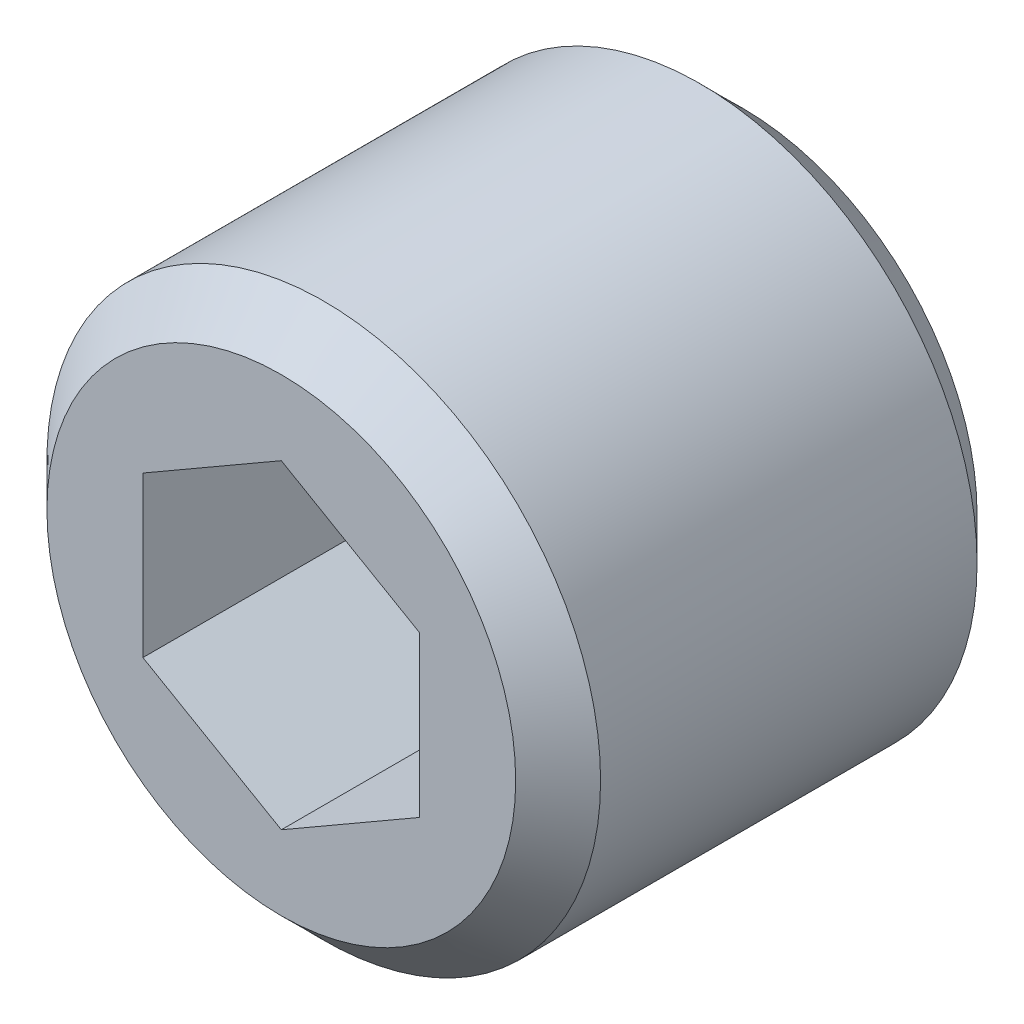
ISO-10303-21;
HEADER;
FILE_DESCRIPTION(('STEP AP214'),'2;1');
FILE_NAME('part.step','',(''),(''),'','','');
FILE_SCHEMA(('AUTOMOTIVE_DESIGN { 1 0 10303 214 1 1 1 1 }'));
ENDSEC;
DATA;
#1=APPLICATION_CONTEXT('core data for automotive mechanical design processes');
#2=APPLICATION_PROTOCOL_DEFINITION('international standard','automotive_design',2000,#1);
#3=PRODUCT_CONTEXT('',#1,'mechanical');
#4=PRODUCT('Part','Part','',(#3));
#5=PRODUCT_RELATED_PRODUCT_CATEGORY('part','',(#4));
#6=PRODUCT_DEFINITION_FORMATION('','',#4);
#7=PRODUCT_DEFINITION_CONTEXT('part definition',#1,'design');
#8=PRODUCT_DEFINITION('design','',#6,#7);
#9=PRODUCT_DEFINITION_SHAPE('','',#8);
#10=(LENGTH_UNIT() NAMED_UNIT(*) SI_UNIT(.MILLI.,.METRE.));
#11=(NAMED_UNIT(*) PLANE_ANGLE_UNIT() SI_UNIT($,.RADIAN.));
#12=(NAMED_UNIT(*) SI_UNIT($,.STERADIAN.) SOLID_ANGLE_UNIT());
#13=UNCERTAINTY_MEASURE_WITH_UNIT(LENGTH_MEASURE(1.E-05),#10,'distance_accuracy_value','');
#14=(GEOMETRIC_REPRESENTATION_CONTEXT(3) GLOBAL_UNCERTAINTY_ASSIGNED_CONTEXT((#13)) GLOBAL_UNIT_ASSIGNED_CONTEXT((#10,
#11,#12)) REPRESENTATION_CONTEXT('',''));
#15=CARTESIAN_POINT('',(0.,0.,0.));
#16=DIRECTION('',(0.,0.,1.));
#17=DIRECTION('',(1.,0.,0.));
#18=AXIS2_PLACEMENT_3D('',#15,#16,#17);
#19=CARTESIAN_POINT('',(0.,0.,10.));
#20=DIRECTION('',(0.,0.,-1.));
#21=DIRECTION('',(-1.,0.,0.));
#22=AXIS2_PLACEMENT_3D('',#19,#20,#21);
#23=PLANE('',#22);
#24=CARTESIAN_POINT('',(0.,0.,10.));
#25=DIRECTION('',(0.,0.,1.));
#26=DIRECTION('',(1.,0.,0.));
#27=AXIS2_PLACEMENT_3D('',#24,#25,#26);
#28=CIRCLE('',#27,5.08);
#29=CARTESIAN_POINT('',(5.08,0.,10.));
#30=VERTEX_POINT('',#29);
#31=EDGE_CURVE('E143',#30,#30,#28,.T.);
#32=ORIENTED_EDGE('',*,*,#31,.T.);
#33=EDGE_LOOP('',(#32));
#34=FACE_BOUND('',#33,.T.);
#35=DIRECTION('',(-0.866025403784439,-0.5,0.));
#36=VECTOR('',#35,1.);
#37=CARTESIAN_POINT('',(0.,3.46410161513775,10.));
#38=LINE('',#37,#36);
#39=CARTESIAN_POINT('',(0.,3.46410161513775,10.));
#40=VERTEX_POINT('',#39);
#41=CARTESIAN_POINT('',(-3.,1.73205080756888,10.));
#42=VERTEX_POINT('',#41);
#43=EDGE_CURVE('E111',#40,#42,#38,.T.);
#44=ORIENTED_EDGE('',*,*,#43,.F.);
#45=DIRECTION('',(-0.866025403784439,0.5,0.));
#46=VECTOR('',#45,1.);
#47=CARTESIAN_POINT('',(3.,1.73205080756888,10.));
#48=LINE('',#47,#46);
#49=CARTESIAN_POINT('',(3.,1.73205080756888,10.));
#50=VERTEX_POINT('',#49);
#51=EDGE_CURVE('E123',#50,#40,#48,.T.);
#52=ORIENTED_EDGE('',*,*,#51,.F.);
#53=DIRECTION('',(0.,1.,0.));
#54=VECTOR('',#53,1.);
#55=CARTESIAN_POINT('',(3.,-1.73205080756888,10.));
#56=LINE('',#55,#54);
#57=CARTESIAN_POINT('',(3.,-1.73205080756888,10.));
#58=VERTEX_POINT('',#57);
#59=EDGE_CURVE('E117',#58,#50,#56,.T.);
#60=ORIENTED_EDGE('',*,*,#59,.F.);
#61=DIRECTION('',(0.866025403784439,0.5,0.));
#62=VECTOR('',#61,1.);
#63=CARTESIAN_POINT('',(0.,-3.46410161513775,10.));
#64=LINE('',#63,#62);
#65=CARTESIAN_POINT('',(0.,-3.46410161513775,10.));
#66=VERTEX_POINT('',#65);
#67=EDGE_CURVE('E115',#66,#58,#64,.T.);
#68=ORIENTED_EDGE('',*,*,#67,.F.);
#69=DIRECTION('',(0.866025403784439,-0.5,0.));
#70=VECTOR('',#69,1.);
#71=CARTESIAN_POINT('',(-3.,-1.73205080756888,10.));
#72=LINE('',#71,#70);
#73=CARTESIAN_POINT('',(-3.,-1.73205080756888,10.));
#74=VERTEX_POINT('',#73);
#75=EDGE_CURVE('E96',#74,#66,#72,.T.);
#76=ORIENTED_EDGE('',*,*,#75,.F.);
#77=DIRECTION('',(0.,-1.,0.));
#78=VECTOR('',#77,1.);
#79=CARTESIAN_POINT('',(-3.,1.73205080756888,10.));
#80=LINE('',#79,#78);
#81=EDGE_CURVE('E105',#42,#74,#80,.T.);
#82=ORIENTED_EDGE('',*,*,#81,.F.);
#83=EDGE_LOOP('',(#44,#52,#60,#68,#76,#82));
#84=FACE_BOUND('',#83,.T.);
#85=ADVANCED_FACE('F37',(#34,#84),#23,.F.);
#86=CARTESIAN_POINT('',(0.,0.,9.08));
#87=DIRECTION('',(0.,0.,-1.));
#88=DIRECTION('',(-1.,0.,0.));
#89=AXIS2_PLACEMENT_3D('',#86,#87,#88);
#90=CONICAL_SURFACE('',#89,6.,0.785398163397448);
#91=ORIENTED_EDGE('',*,*,#31,.F.);
#92=EDGE_LOOP('',(#91));
#93=FACE_BOUND('',#92,.T.);
#94=CARTESIAN_POINT('',(0.,0.,9.08));
#95=DIRECTION('',(0.,0.,1.));
#96=DIRECTION('',(1.,0.,0.));
#97=AXIS2_PLACEMENT_3D('',#94,#95,#96);
#98=CIRCLE('',#97,6.);
#99=CARTESIAN_POINT('',(6.,0.,9.08));
#100=VERTEX_POINT('',#99);
#101=EDGE_CURVE('E140',#100,#100,#98,.T.);
#102=ORIENTED_EDGE('',*,*,#101,.T.);
#103=EDGE_LOOP('',(#102));
#104=FACE_BOUND('',#103,.T.);
#105=ADVANCED_FACE('F205',(#93,#104),#90,.T.);
#106=CARTESIAN_POINT('',(0.,0.,0.));
#107=DIRECTION('',(0.,0.,1.));
#108=DIRECTION('',(1.,0.,0.));
#109=AXIS2_PLACEMENT_3D('',#106,#107,#108);
#110=CYLINDRICAL_SURFACE('',#109,6.);
#111=ORIENTED_EDGE('',*,*,#101,.F.);
#112=EDGE_LOOP('',(#111));
#113=FACE_BOUND('',#112,.T.);
#114=CARTESIAN_POINT('',(0.,0.,0.92));
#115=DIRECTION('',(0.,0.,1.));
#116=DIRECTION('',(1.,0.,0.));
#117=AXIS2_PLACEMENT_3D('',#114,#115,#116);
#118=CIRCLE('',#117,6.);
#119=CARTESIAN_POINT('',(6.,0.,0.92));
#120=VERTEX_POINT('',#119);
#121=EDGE_CURVE('E137',#120,#120,#118,.T.);
#122=ORIENTED_EDGE('',*,*,#121,.T.);
#123=EDGE_LOOP('',(#122));
#124=FACE_BOUND('',#123,.T.);
#125=ADVANCED_FACE('F210',(#113,#124),#110,.T.);
#126=CARTESIAN_POINT('',(0.,0.,0.));
#127=DIRECTION('',(0.,0.,1.));
#128=DIRECTION('',(1.,0.,0.));
#129=AXIS2_PLACEMENT_3D('',#126,#127,#128);
#130=CONICAL_SURFACE('',#129,5.08,0.785398163397448);
#131=ORIENTED_EDGE('',*,*,#121,.F.);
#132=EDGE_LOOP('',(#131));
#133=FACE_BOUND('',#132,.T.);
#134=CARTESIAN_POINT('',(0.,0.,0.));
#135=DIRECTION('',(0.,0.,1.));
#136=DIRECTION('',(1.,0.,0.));
#137=AXIS2_PLACEMENT_3D('',#134,#135,#136);
#138=CIRCLE('',#137,5.08);
#139=CARTESIAN_POINT('',(5.08,0.,0.));
#140=VERTEX_POINT('',#139);
#141=EDGE_CURVE('E128',#140,#140,#138,.T.);
#142=ORIENTED_EDGE('',*,*,#141,.T.);
#143=EDGE_LOOP('',(#142));
#144=FACE_BOUND('',#143,.T.);
#145=ADVANCED_FACE('F218',(#133,#144),#130,.T.);
#146=CARTESIAN_POINT('',(0.,5.08,0.));
#147=DIRECTION('',(0.,0.,1.));
#148=DIRECTION('',(1.,0.,0.));
#149=AXIS2_PLACEMENT_3D('',#146,#147,#148);
#150=PLANE('',#149);
#151=ORIENTED_EDGE('',*,*,#141,.F.);
#152=EDGE_LOOP('',(#151));
#153=FACE_BOUND('',#152,.T.);
#154=ADVANCED_FACE('F164',(#153),#150,.F.);
#155=CARTESIAN_POINT('',(0.,3.46410161513775,2.5));
#156=DIRECTION('',(-0.5,0.866025403784439,0.));
#157=DIRECTION('',(-0.866025403784439,-0.5,0.));
#158=AXIS2_PLACEMENT_3D('',#155,#156,#157);
#159=PLANE('',#158);
#160=CARTESIAN_POINT('',(0.0002,3.46421708519159,4.71139153540508));
#161=CARTESIAN_POINT('',(-0.131635206588332,3.38810199317915,4.66742937742637));
#162=CARTESIAN_POINT('',(-0.264608405355249,3.31132988107606,4.62744725926669));
#163=CARTESIAN_POINT('',(-0.532857420002056,3.15645624025988,4.55765775341953));
#164=CARTESIAN_POINT('',(-0.668138002634342,3.078351959461,4.52787505523945));
#165=CARTESIAN_POINT('',(-0.937022602096483,2.92311136358059,4.48151351218532));
#166=CARTESIAN_POINT('',(-1.07058524542946,2.84599893549861,4.46462611409702));
#167=CARTESIAN_POINT('',(-1.33833905729569,2.6914112001411,4.44446531542259));
#168=CARTESIAN_POINT('',(-1.47252925247984,2.61393645482892,4.44117522075515));
#169=CARTESIAN_POINT('',(-1.72327559769581,2.46916798492017,4.44801620385946));
#170=CARTESIAN_POINT('',(-1.83986926497268,2.40185259973206,4.45646758716668));
#171=CARTESIAN_POINT('',(-2.07229698497464,2.2676603930218,4.4832546159811));
#172=CARTESIAN_POINT('',(-2.18813023365133,2.2007840357172,4.50159941383578));
#173=CARTESIAN_POINT('',(-2.42103725705637,2.06631510305815,4.54746042382739));
#174=CARTESIAN_POINT('',(-2.53808155051394,1.99873954872331,4.57517105823715));
#175=CARTESIAN_POINT('',(-2.77042435049913,1.86459637060759,4.63806346811147));
#176=CARTESIAN_POINT('',(-2.88572583417111,1.79802702797161,4.67323046399562));
#177=CARTESIAN_POINT('',(-3.0002,1.73193533751504,4.71139153540508));
#178=B_SPLINE_CURVE_WITH_KNOTS('',3,(#160,#161,#162,#163,#164,#165,#166,#167,#168,#169,#170,
#171,#172,#173,#174,#175,#176,#177),.UNSPECIFIED.,.F.,.F.,(4,2,2,2,2,2,2,2,4),(0.,
0.475539830103041,0.952222784107964,1.41710776961288,1.88142182298026,2.28572436316091,
2.69040156475039,3.10405572063576,3.5168974940707),.UNSPECIFIED.);
#179=CARTESIAN_POINT('',(0.,3.46410161513775,4.71132486540519));
#180=VERTEX_POINT('',#179);
#181=CARTESIAN_POINT('',(-3.,1.73205080756888,4.71132486540519));
#182=VERTEX_POINT('',#181);
#183=EDGE_CURVE('E11',#180,#182,#178,.T.);
#184=ORIENTED_EDGE('',*,*,#183,.F.);
#185=DIRECTION('',(0.,0.,1.));
#186=VECTOR('',#185,1.);
#187=CARTESIAN_POINT('',(0.,3.46410161513775,2.5));
#188=LINE('',#187,#186);
#189=EDGE_CURVE('E126',#180,#40,#188,.T.);
#190=ORIENTED_EDGE('',*,*,#189,.T.);
#191=ORIENTED_EDGE('',*,*,#43,.T.);
#192=DIRECTION('',(0.,0.,1.));
#193=VECTOR('',#192,1.);
#194=CARTESIAN_POINT('',(-3.,1.73205080756888,2.5));
#195=LINE('',#194,#193);
#196=EDGE_CURVE('E102',#182,#42,#195,.T.);
#197=ORIENTED_EDGE('',*,*,#196,.F.);
#198=EDGE_LOOP('',(#184,#190,#191,#197));
#199=FACE_BOUND('',#198,.T.);
#200=ADVANCED_FACE('F162',(#199),#159,.F.);
#201=CARTESIAN_POINT('',(3.,1.73205080756888,2.5));
#202=DIRECTION('',(0.5,0.866025403784439,0.));
#203=DIRECTION('',(-0.866025403784439,0.5,0.));
#204=AXIS2_PLACEMENT_3D('',#201,#202,#203);
#205=PLANE('',#204);
#206=CARTESIAN_POINT('',(3.0002,1.73193533751504,4.71139153540508));
#207=CARTESIAN_POINT('',(2.86836479341167,1.80805042952748,4.66742937742637));
#208=CARTESIAN_POINT('',(2.73539159464475,1.88482254163057,4.62744725926669));
#209=CARTESIAN_POINT('',(2.46714257999794,2.03969618244675,4.55765775341953));
#210=CARTESIAN_POINT('',(2.33186199736566,2.11780046324563,4.52787505523945));
#211=CARTESIAN_POINT('',(2.06297739790352,2.27304105912605,4.48151351218532));
#212=CARTESIAN_POINT('',(1.92941475457054,2.35015348720802,4.46462611409702));
#213=CARTESIAN_POINT('',(1.66166094270431,2.50474122256553,4.44446531542259));
#214=CARTESIAN_POINT('',(1.52747074752016,2.58221596787771,4.44117522075515));
#215=CARTESIAN_POINT('',(1.27672440230419,2.72698443778646,4.44801620385946));
#216=CARTESIAN_POINT('',(1.16013073502732,2.79429982297457,4.45646758716668));
#217=CARTESIAN_POINT('',(0.927703015025363,2.92849202968483,4.4832546159811));
#218=CARTESIAN_POINT('',(0.811869766348669,2.99536838698943,4.50159941383578));
#219=CARTESIAN_POINT('',(0.578962742943632,3.12983731964848,4.54746042382739));
#220=CARTESIAN_POINT('',(0.461918449486059,3.19741287398332,4.57517105823715));
#221=CARTESIAN_POINT('',(0.229575649500875,3.33155605209904,4.63806346811147));
#222=CARTESIAN_POINT('',(0.114274165828893,3.39812539473502,4.67323046399562));
#223=CARTESIAN_POINT('',(-0.000199999999999983,3.46421708519159,4.71139153540508));
#224=B_SPLINE_CURVE_WITH_KNOTS('',3,(#206,#207,#208,#209,#210,#211,#212,#213,#214,#215,#216,
#217,#218,#219,#220,#221,#222,#223),.UNSPECIFIED.,.F.,.F.,(4,2,2,2,2,2,2,2,4),(0.,
0.475539830103041,0.952222784107965,1.41710776961288,1.88142182298026,2.28572436316091,
2.69040156475039,3.10405572063576,3.5168974940707),.UNSPECIFIED.);
#225=CARTESIAN_POINT('',(3.,1.73205080756888,4.71132486540519));
#226=VERTEX_POINT('',#225);
#227=EDGE_CURVE('E49',#226,#180,#224,.T.);
#228=ORIENTED_EDGE('',*,*,#227,.F.);
#229=DIRECTION('',(0.,0.,1.));
#230=VECTOR('',#229,1.);
#231=CARTESIAN_POINT('',(3.,1.73205080756888,2.5));
#232=LINE('',#231,#230);
#233=EDGE_CURVE('E129',#226,#50,#232,.T.);
#234=ORIENTED_EDGE('',*,*,#233,.T.);
#235=ORIENTED_EDGE('',*,*,#51,.T.);
#236=ORIENTED_EDGE('',*,*,#189,.F.);
#237=EDGE_LOOP('',(#228,#234,#235,#236));
#238=FACE_BOUND('',#237,.T.);
#239=ADVANCED_FACE('F187',(#238),#205,.F.);
#240=CARTESIAN_POINT('',(3.,-1.73205080756888,2.5));
#241=DIRECTION('',(1.,0.,0.));
#242=DIRECTION('',(0.,0.,-1.));
#243=AXIS2_PLACEMENT_3D('',#240,#241,#242);
#244=PLANE('',#243);
#245=CARTESIAN_POINT('',(3.,-4.55230689403347,5.85899585930235));
#246=CARTESIAN_POINT('',(3.,-4.42203285683307,5.7962111628357));
#247=CARTESIAN_POINT('',(3.,-4.29144864140818,5.73405844321591));
#248=CARTESIAN_POINT('',(3.,-4.02949438213665,5.61137477637716));
#249=CARTESIAN_POINT('',(3.,-3.89812420827163,5.55084410710208));
#250=CARTESIAN_POINT('',(3.,-3.6337067113352,5.43143621632039));
#251=CARTESIAN_POINT('',(3.,-3.50065407388474,5.37257072012657));
#252=CARTESIAN_POINT('',(3.,-3.23345415290409,5.25738841221934));
#253=CARTESIAN_POINT('',(3.,-3.09930692480774,5.20107147237228));
#254=CARTESIAN_POINT('',(3.,-2.82588517797245,5.09011307579175));
#255=CARTESIAN_POINT('',(3.,-2.68657294057704,5.03556403326917));
#256=CARTESIAN_POINT('',(3.,-2.40628236551813,4.93084240932163));
#257=CARTESIAN_POINT('',(3.,-2.26530383804691,4.88067033204167));
#258=CARTESIAN_POINT('',(3.,-1.98175401159729,4.78609298143692));
#259=CARTESIAN_POINT('',(3.,-1.83918695231228,4.74167513073786));
#260=CARTESIAN_POINT('',(3.,-1.55201210630947,4.66009640628812));
#261=CARTESIAN_POINT('',(3.,-1.40740500925706,4.62293314020297));
#262=CARTESIAN_POINT('',(3.,-1.1167965938135,4.55788959953983));
#263=CARTESIAN_POINT('',(3.,-0.970805099385889,4.52996626721176));
#264=CARTESIAN_POINT('',(3.,-0.677117813764697,4.485066605421));
#265=CARTESIAN_POINT('',(3.,-0.529422162917341,4.46808938094696));
#266=CARTESIAN_POINT('',(3.,-0.234947872719646,4.44665893994668));
#267=CARTESIAN_POINT('',(3.,-0.0881806476191099,4.44205270381854));
#268=CARTESIAN_POINT('',(3.,0.205223700430044,4.44535767658371));
#269=CARTESIAN_POINT('',(3.,0.351860816135455,4.45326954337094));
#270=CARTESIAN_POINT('',(3.,0.6038143144584,4.47707569150937));
#271=CARTESIAN_POINT('',(3.,0.709408361992604,4.49017769585107));
#272=CARTESIAN_POINT('',(3.,0.919752203146273,4.52200144465044));
#273=CARTESIAN_POINT('',(3.,1.0245018670034,4.54072403657188));
#274=CARTESIAN_POINT('',(3.,1.33737934263405,4.60433074195981));
#275=CARTESIAN_POINT('',(3.,1.5440105429606,4.65664047336866));
#276=CARTESIAN_POINT('',(3.,1.85301747518895,4.74647581628311));
#277=CARTESIAN_POINT('',(3.,1.95701259047927,4.77874047880009));
#278=CARTESIAN_POINT('',(3.,2.16399092996711,4.84639542154271));
#279=CARTESIAN_POINT('',(3.,2.26697414681474,4.88178572445271));
#280=CARTESIAN_POINT('',(3.,2.47196758644286,4.9551426835252));
#281=CARTESIAN_POINT('',(3.,2.57397815476855,4.99310838264893));
#282=CARTESIAN_POINT('',(3.,2.77716764226868,5.07119196477891));
#283=CARTESIAN_POINT('',(3.,2.87834657691569,5.11130980763946));
#284=CARTESIAN_POINT('',(3.,3.1427988397967,5.21889117201627));
#285=CARTESIAN_POINT('',(3.,3.30547673060152,5.28781669676308));
#286=CARTESIAN_POINT('',(3.,3.62929414058288,5.4292025916987));
#287=CARTESIAN_POINT('',(3.,3.79043352555562,5.50166326695025));
#288=CARTESIAN_POINT('',(3.,4.11151294519169,5.64930087634801));
#289=CARTESIAN_POINT('',(3.,4.27145263944,5.72447854867576));
#290=CARTESIAN_POINT('',(3.,4.59033118664394,5.87693083602436));
#291=CARTESIAN_POINT('',(3.,4.74927001468937,5.9542055029844));
#292=CARTESIAN_POINT('',(3.,5.22528915394053,6.18868132540013));
#293=CARTESIAN_POINT('',(3.,5.54115737515172,6.3483405284975));
#294=CARTESIAN_POINT('',(3.,6.17067040855709,6.67182875308413));
#295=CARTESIAN_POINT('',(3.,6.48431557808157,6.83565708406486));
#296=CARTESIAN_POINT('',(3.,7.07911538948717,7.14982892231997));
#297=CARTESIAN_POINT('',(3.,7.36041306603152,7.29990207130388));
#298=CARTESIAN_POINT('',(3.,7.92210237114853,7.60176445255836));
#299=CARTESIAN_POINT('',(3.,8.20249395488181,7.7535537681332));
#300=CARTESIAN_POINT('',(3.,8.7617995572567,8.05798833967632));
#301=CARTESIAN_POINT('',(3.,9.0407155161595,8.21063003499564));
#302=CARTESIAN_POINT('',(3.,9.59798153995336,8.51690105922796));
#303=CARTESIAN_POINT('',(3.,9.87633164004697,8.67053032406442));
#304=CARTESIAN_POINT('',(3.,10.1544806879411,8.82452037571372));
#305=B_SPLINE_CURVE_WITH_KNOTS('',3,(#245,#246,#247,#248,#249,#250,#251,#252,#253,#254,#255,
#256,#257,#258,#259,#260,#261,#262,#263,#264,#265,#266,#267,#268,#269,#270,#271,#272,#273,#274,
#275,#276,#277,#278,#279,#280,#281,#282,#283,#284,#285,#286,#287,#288,#289,#290,#291,#292,#293,
#294,#295,#296,#297,#298,#299,#300,#301,#302,#303,#304),.UNSPECIFIED.,.F.,.F.,(4,2,2,2,2,2,2,2,
2,2,2,2,2,2,2,2,2,2,2,2,2,2,2,2,2,2,2,2,2,4),(0.,0.433848178986765,0.867770230034187,
1.30422725772764,1.74066231725496,2.18943900628356,2.63826731798253,3.08609742238509,
3.53377959605673,3.97934520292968,4.42487437339345,4.86486674840802,5.30488224816703,
5.6239370805205,5.9430400436666,6.58162169144084,6.90825264139163,7.23488596206567,
7.56139856105755,7.8879050714581,8.41787496800851,8.9478906790237,9.47805148892785,
10.0082254420718,11.0699463742264,12.1314925896742,13.0879639709203,14.0444819811936,
14.9983363457967,15.9521294337999),.UNSPECIFIED.);
#306=CARTESIAN_POINT('',(3.,-1.73205080756888,4.71132486540519));
#307=VERTEX_POINT('',#306);
#308=EDGE_CURVE('E177',#307,#226,#305,.T.);
#309=ORIENTED_EDGE('',*,*,#308,.F.);
#310=DIRECTION('',(0.,0.,1.));
#311=VECTOR('',#310,1.);
#312=CARTESIAN_POINT('',(3.,-1.73205080756888,2.5));
#313=LINE('',#312,#311);
#314=EDGE_CURVE('E131',#307,#58,#313,.T.);
#315=ORIENTED_EDGE('',*,*,#314,.T.);
#316=ORIENTED_EDGE('',*,*,#59,.T.);
#317=ORIENTED_EDGE('',*,*,#233,.F.);
#318=EDGE_LOOP('',(#309,#315,#316,#317));
#319=FACE_BOUND('',#318,.T.);
#320=ADVANCED_FACE('F190',(#319),#244,.F.);
#321=CARTESIAN_POINT('',(0.,-3.46410161513775,2.5));
#322=DIRECTION('',(0.5,-0.866025403784439,0.));
#323=DIRECTION('',(0.866025403784439,0.5,0.));
#324=AXIS2_PLACEMENT_3D('',#321,#322,#323);
#325=PLANE('',#324);
#326=CARTESIAN_POINT('',(-0.0002,-3.46421708519159,4.71139153540508));
#327=CARTESIAN_POINT('',(0.131635206588332,-3.38810199317915,4.66742937742637));
#328=CARTESIAN_POINT('',(0.264608405355249,-3.31132988107606,4.62744725926669));
#329=CARTESIAN_POINT('',(0.532857420002056,-3.15645624025988,4.55765775341953));
#330=CARTESIAN_POINT('',(0.668138002634342,-3.078351959461,4.52787505523945));
#331=CARTESIAN_POINT('',(0.937022602096483,-2.92311136358059,4.48151351218532));
#332=CARTESIAN_POINT('',(1.07058524542946,-2.84599893549861,4.46462611409702));
#333=CARTESIAN_POINT('',(1.33833905729569,-2.6914112001411,4.44446531542259));
#334=CARTESIAN_POINT('',(1.47252925247984,-2.61393645482892,4.44117522075515));
#335=CARTESIAN_POINT('',(1.72327559769581,-2.46916798492017,4.44801620385946));
#336=CARTESIAN_POINT('',(1.83986926497268,-2.40185259973206,4.45646758716668));
#337=CARTESIAN_POINT('',(2.07229698497464,-2.2676603930218,4.4832546159811));
#338=CARTESIAN_POINT('',(2.18813023365133,-2.2007840357172,4.50159941383578));
#339=CARTESIAN_POINT('',(2.42103725705637,-2.06631510305815,4.54746042382739));
#340=CARTESIAN_POINT('',(2.53808155051394,-1.99873954872331,4.57517105823715));
#341=CARTESIAN_POINT('',(2.77042435049913,-1.86459637060759,4.63806346811147));
#342=CARTESIAN_POINT('',(2.88572583417111,-1.79802702797161,4.67323046399562));
#343=CARTESIAN_POINT('',(3.0002,-1.73193533751504,4.71139153540508));
#344=B_SPLINE_CURVE_WITH_KNOTS('',3,(#326,#327,#328,#329,#330,#331,#332,#333,#334,#335,#336,
#337,#338,#339,#340,#341,#342,#343),.UNSPECIFIED.,.F.,.F.,(4,2,2,2,2,2,2,2,4),(0.,
0.475539830103041,0.952222784107964,1.41710776961288,1.88142182298026,2.28572436316091,
2.69040156475039,3.10405572063576,3.5168974940707),.UNSPECIFIED.);
#345=CARTESIAN_POINT('',(0.,-3.46410161513775,4.71132486540519));
#346=VERTEX_POINT('',#345);
#347=EDGE_CURVE('E171',#346,#307,#344,.T.);
#348=ORIENTED_EDGE('',*,*,#347,.F.);
#349=DIRECTION('',(0.,0.,1.));
#350=VECTOR('',#349,1.);
#351=CARTESIAN_POINT('',(0.,-3.46410161513775,2.5));
#352=LINE('',#351,#350);
#353=EDGE_CURVE('E101',#346,#66,#352,.T.);
#354=ORIENTED_EDGE('',*,*,#353,.T.);
#355=ORIENTED_EDGE('',*,*,#67,.T.);
#356=ORIENTED_EDGE('',*,*,#314,.F.);
#357=EDGE_LOOP('',(#348,#354,#355,#356));
#358=FACE_BOUND('',#357,.T.);
#359=ADVANCED_FACE('F194',(#358),#325,.F.);
#360=CARTESIAN_POINT('',(-3.,-1.73205080756888,2.5));
#361=DIRECTION('',(-0.5,-0.866025403784439,0.));
#362=DIRECTION('',(0.866025403784439,-0.5,0.));
#363=AXIS2_PLACEMENT_3D('',#360,#361,#362);
#364=PLANE('',#363);
#365=CARTESIAN_POINT('',(-3.0002,-1.73193533751504,4.71139153540508));
#366=CARTESIAN_POINT('',(-2.86836479341167,-1.80805042952748,4.66742937742637));
#367=CARTESIAN_POINT('',(-2.73539159464475,-1.88482254163057,4.62744725926669));
#368=CARTESIAN_POINT('',(-2.46714257999794,-2.03969618244675,4.55765775341953));
#369=CARTESIAN_POINT('',(-2.33186199736566,-2.11780046324563,4.52787505523945));
#370=CARTESIAN_POINT('',(-2.06297739790352,-2.27304105912605,4.48151351218532));
#371=CARTESIAN_POINT('',(-1.92941475457054,-2.35015348720802,4.46462611409702));
#372=CARTESIAN_POINT('',(-1.66166094270431,-2.50474122256553,4.44446531542259));
#373=CARTESIAN_POINT('',(-1.52747074752016,-2.58221596787771,4.44117522075515));
#374=CARTESIAN_POINT('',(-1.27672440230419,-2.72698443778646,4.44801620385946));
#375=CARTESIAN_POINT('',(-1.16013073502732,-2.79429982297457,4.45646758716668));
#376=CARTESIAN_POINT('',(-0.927703015025363,-2.92849202968483,4.4832546159811));
#377=CARTESIAN_POINT('',(-0.811869766348669,-2.99536838698943,4.50159941383578));
#378=CARTESIAN_POINT('',(-0.578962742943632,-3.12983731964848,4.54746042382739));
#379=CARTESIAN_POINT('',(-0.461918449486059,-3.19741287398332,4.57517105823715));
#380=CARTESIAN_POINT('',(-0.229575649500875,-3.33155605209904,4.63806346811147));
#381=CARTESIAN_POINT('',(-0.114274165828893,-3.39812539473502,4.67323046399562));
#382=CARTESIAN_POINT('',(0.000199999999999983,-3.46421708519159,4.71139153540508));
#383=B_SPLINE_CURVE_WITH_KNOTS('',3,(#365,#366,#367,#368,#369,#370,#371,#372,#373,#374,#375,
#376,#377,#378,#379,#380,#381,#382),.UNSPECIFIED.,.F.,.F.,(4,2,2,2,2,2,2,2,4),(0.,
0.475539830103041,0.952222784107965,1.41710776961288,1.88142182298026,2.28572436316091,
2.69040156475039,3.10405572063576,3.5168974940707),.UNSPECIFIED.);
#384=CARTESIAN_POINT('',(-3.,-1.73205080756888,4.71132486540519));
#385=VERTEX_POINT('',#384);
#386=EDGE_CURVE('E99',#385,#346,#383,.T.);
#387=ORIENTED_EDGE('',*,*,#386,.F.);
#388=DIRECTION('',(0.,0.,1.));
#389=VECTOR('',#388,1.);
#390=CARTESIAN_POINT('',(-3.,-1.73205080756888,2.5));
#391=LINE('',#390,#389);
#392=EDGE_CURVE('E56',#385,#74,#391,.T.);
#393=ORIENTED_EDGE('',*,*,#392,.T.);
#394=ORIENTED_EDGE('',*,*,#75,.T.);
#395=ORIENTED_EDGE('',*,*,#353,.F.);
#396=EDGE_LOOP('',(#387,#393,#394,#395));
#397=FACE_BOUND('',#396,.T.);
#398=ADVANCED_FACE('F93',(#397),#364,.F.);
#399=CARTESIAN_POINT('',(-3.,1.73205080756888,2.5));
#400=DIRECTION('',(-1.,0.,0.));
#401=DIRECTION('',(0.,0.,1.));
#402=AXIS2_PLACEMENT_3D('',#399,#400,#401);
#403=PLANE('',#402);
#404=CARTESIAN_POINT('',(-3.,-4.55230689403347,5.85899585930235));
#405=CARTESIAN_POINT('',(-3.,-4.42203285683307,5.7962111628357));
#406=CARTESIAN_POINT('',(-3.,-4.29144864140818,5.73405844321591));
#407=CARTESIAN_POINT('',(-3.,-4.02949438213665,5.61137477637716));
#408=CARTESIAN_POINT('',(-3.,-3.89812420827163,5.55084410710208));
#409=CARTESIAN_POINT('',(-3.,-3.6337067113352,5.43143621632039));
#410=CARTESIAN_POINT('',(-3.,-3.50065407388474,5.37257072012657));
#411=CARTESIAN_POINT('',(-3.,-3.23345415290409,5.25738841221934));
#412=CARTESIAN_POINT('',(-3.,-3.09930692480774,5.20107147237228));
#413=CARTESIAN_POINT('',(-3.,-2.82588517797245,5.09011307579175));
#414=CARTESIAN_POINT('',(-3.,-2.68657294057704,5.03556403326917));
#415=CARTESIAN_POINT('',(-3.,-2.40628236551813,4.93084240932163));
#416=CARTESIAN_POINT('',(-3.,-2.26530383804691,4.88067033204167));
#417=CARTESIAN_POINT('',(-3.,-1.98175401159729,4.78609298143692));
#418=CARTESIAN_POINT('',(-3.,-1.83918695231228,4.74167513073786));
#419=CARTESIAN_POINT('',(-3.,-1.55201210630947,4.66009640628812));
#420=CARTESIAN_POINT('',(-3.,-1.40740500925706,4.62293314020297));
#421=CARTESIAN_POINT('',(-3.,-1.1167965938135,4.55788959953983));
#422=CARTESIAN_POINT('',(-3.,-0.970805099385889,4.52996626721176));
#423=CARTESIAN_POINT('',(-3.,-0.677117813764697,4.485066605421));
#424=CARTESIAN_POINT('',(-3.,-0.529422162917341,4.46808938094696));
#425=CARTESIAN_POINT('',(-3.,-0.234947872719646,4.44665893994668));
#426=CARTESIAN_POINT('',(-3.,-0.0881806476191099,4.44205270381854));
#427=CARTESIAN_POINT('',(-3.,0.205223700430044,4.44535767658371));
#428=CARTESIAN_POINT('',(-3.,0.351860816135455,4.45326954337094));
#429=CARTESIAN_POINT('',(-3.,0.6038143144584,4.47707569150937));
#430=CARTESIAN_POINT('',(-3.,0.709408361992604,4.49017769585107));
#431=CARTESIAN_POINT('',(-3.,0.919752203146273,4.52200144465044));
#432=CARTESIAN_POINT('',(-3.,1.0245018670034,4.54072403657188));
#433=CARTESIAN_POINT('',(-3.,1.33737934263405,4.60433074195981));
#434=CARTESIAN_POINT('',(-3.,1.5440105429606,4.65664047336866));
#435=CARTESIAN_POINT('',(-3.,1.85301747518895,4.74647581628311));
#436=CARTESIAN_POINT('',(-3.,1.95701259047927,4.77874047880009));
#437=CARTESIAN_POINT('',(-3.,2.16399092996711,4.84639542154271));
#438=CARTESIAN_POINT('',(-3.,2.26697414681474,4.88178572445271));
#439=CARTESIAN_POINT('',(-3.,2.47196758644286,4.9551426835252));
#440=CARTESIAN_POINT('',(-3.,2.57397815476855,4.99310838264893));
#441=CARTESIAN_POINT('',(-3.,2.77716764226868,5.07119196477891));
#442=CARTESIAN_POINT('',(-3.,2.87834657691569,5.11130980763946));
#443=CARTESIAN_POINT('',(-3.,3.1427988397967,5.21889117201627));
#444=CARTESIAN_POINT('',(-3.,3.30547673060152,5.28781669676308));
#445=CARTESIAN_POINT('',(-3.,3.62929414058288,5.4292025916987));
#446=CARTESIAN_POINT('',(-3.,3.79043352555562,5.50166326695025));
#447=CARTESIAN_POINT('',(-3.,4.11151294519169,5.64930087634801));
#448=CARTESIAN_POINT('',(-3.,4.27145263944,5.72447854867576));
#449=CARTESIAN_POINT('',(-3.,4.59033118664394,5.87693083602436));
#450=CARTESIAN_POINT('',(-3.,4.74927001468937,5.9542055029844));
#451=CARTESIAN_POINT('',(-3.,5.22528915394053,6.18868132540013));
#452=CARTESIAN_POINT('',(-3.,5.54115737515172,6.3483405284975));
#453=CARTESIAN_POINT('',(-3.,6.17067040855709,6.67182875308413));
#454=CARTESIAN_POINT('',(-3.,6.48431557808157,6.83565708406486));
#455=CARTESIAN_POINT('',(-3.,7.07911538948717,7.14982892231997));
#456=CARTESIAN_POINT('',(-3.,7.36041306603152,7.29990207130388));
#457=CARTESIAN_POINT('',(-3.,7.92210237114853,7.60176445255836));
#458=CARTESIAN_POINT('',(-3.,8.20249395488181,7.7535537681332));
#459=CARTESIAN_POINT('',(-3.,8.7617995572567,8.05798833967632));
#460=CARTESIAN_POINT('',(-3.,9.0407155161595,8.21063003499564));
#461=CARTESIAN_POINT('',(-3.,9.59798153995336,8.51690105922796));
#462=CARTESIAN_POINT('',(-3.,9.87633164004697,8.67053032406442));
#463=CARTESIAN_POINT('',(-3.,10.1544806879411,8.82452037571372));
#464=B_SPLINE_CURVE_WITH_KNOTS('',3,(#404,#405,#406,#407,#408,#409,#410,#411,#412,#413,#414,
#415,#416,#417,#418,#419,#420,#421,#422,#423,#424,#425,#426,#427,#428,#429,#430,#431,#432,#433,
#434,#435,#436,#437,#438,#439,#440,#441,#442,#443,#444,#445,#446,#447,#448,#449,#450,#451,#452,
#453,#454,#455,#456,#457,#458,#459,#460,#461,#462,#463),.UNSPECIFIED.,.F.,.F.,(4,2,2,2,2,2,2,2,
2,2,2,2,2,2,2,2,2,2,2,2,2,2,2,2,2,2,2,2,2,4),(0.,0.433848178986765,0.867770230034187,
1.30422725772764,1.74066231725496,2.18943900628356,2.63826731798253,3.08609742238509,
3.53377959605673,3.97934520292968,4.42487437339345,4.86486674840802,5.30488224816703,
5.6239370805205,5.9430400436666,6.58162169144084,6.90825264139163,7.23488596206567,
7.56139856105755,7.8879050714581,8.41787496800851,8.9478906790237,9.47805148892785,
10.0082254420718,11.0699463742264,12.1314925896742,13.0879639709203,14.0444819811936,
14.9983363457967,15.9521294337999),.UNSPECIFIED.);
#465=EDGE_CURVE('E146',#182,#385,#464,.F.);
#466=ORIENTED_EDGE('',*,*,#465,.F.);
#467=ORIENTED_EDGE('',*,*,#196,.T.);
#468=ORIENTED_EDGE('',*,*,#81,.T.);
#469=ORIENTED_EDGE('',*,*,#392,.F.);
#470=EDGE_LOOP('',(#466,#467,#468,#469));
#471=FACE_BOUND('',#470,.T.);
#472=ADVANCED_FACE('F106',(#471),#403,.F.);
#473=CARTESIAN_POINT('',(0.,0.,2.71132486540519));
#474=DIRECTION('',(0.,0.,1.));
#475=DIRECTION('',(1.,0.,0.));
#476=AXIS2_PLACEMENT_3D('',#473,#474,#475);
#477=CONICAL_SURFACE('',#476,0.,1.0471975511966);
#478=CARTESIAN_POINT('',(0.,0.,2.71132486540519));
#479=VERTEX_POINT('',#478);
#480=VERTEX_LOOP('',#479);
#481=FACE_BOUND('',#480,.T.);
#482=ORIENTED_EDGE('',*,*,#227,.T.);
#483=ORIENTED_EDGE('',*,*,#183,.T.);
#484=ORIENTED_EDGE('',*,*,#465,.T.);
#485=ORIENTED_EDGE('',*,*,#386,.T.);
#486=ORIENTED_EDGE('',*,*,#347,.T.);
#487=ORIENTED_EDGE('',*,*,#308,.T.);
#488=EDGE_LOOP('',(#482,#483,#484,#485,#486,#487));
#489=FACE_BOUND('',#488,.T.);
#490=ADVANCED_FACE('F158',(#481,#489),#477,.F.);
#491=CLOSED_SHELL('',(#85,#105,#125,#145,#154,#200,#239,#320,#359,#398,#472,#490));
#492=MANIFOLD_SOLID_BREP('B2',#491);
#493=ADVANCED_BREP_SHAPE_REPRESENTATION('',(#18,#492),#14);
#494=SHAPE_DEFINITION_REPRESENTATION(#9,#493);
ENDSEC;
END-ISO-10303-21;
